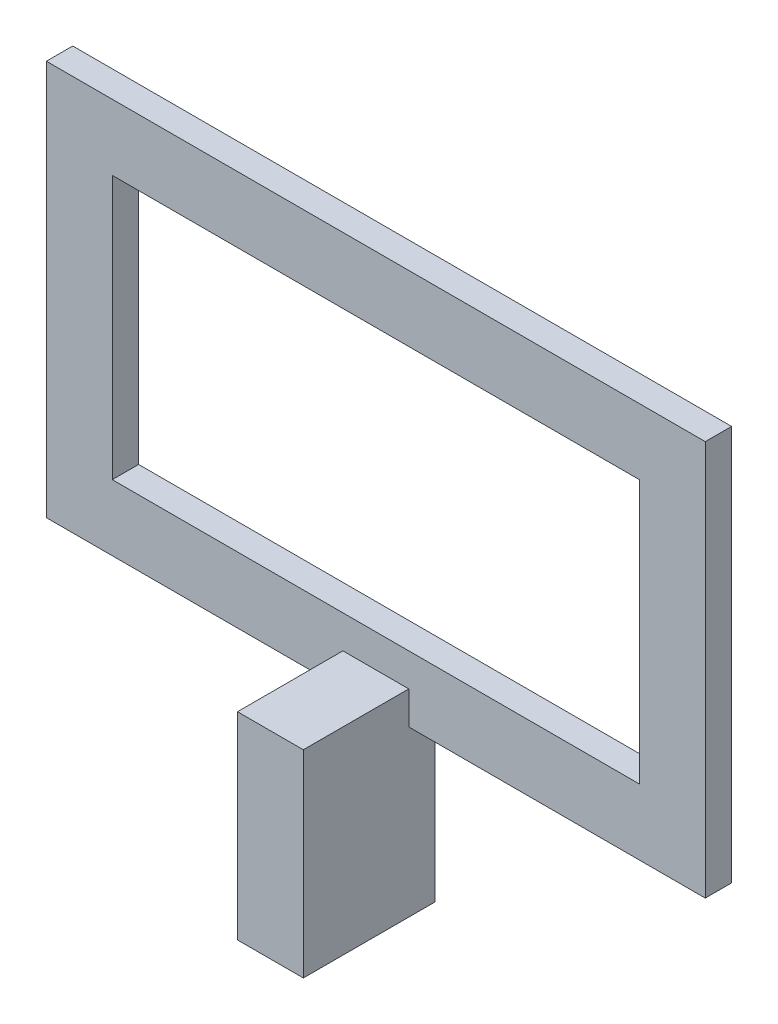
ISO-10303-21;
HEADER;
FILE_DESCRIPTION(('STEP AP214'),'2;1');
FILE_NAME('part.step','',(''),(''),'','','');
FILE_SCHEMA(('AUTOMOTIVE_DESIGN { 1 0 10303 214 1 1 1 1 }'));
ENDSEC;
DATA;
#1=APPLICATION_CONTEXT('core data for automotive mechanical design processes');
#2=APPLICATION_PROTOCOL_DEFINITION('international standard','automotive_design',2000,#1);
#3=PRODUCT_CONTEXT('',#1,'mechanical');
#4=PRODUCT('Part','Part','',(#3));
#5=PRODUCT_RELATED_PRODUCT_CATEGORY('part','',(#4));
#6=PRODUCT_DEFINITION_FORMATION('','',#4);
#7=PRODUCT_DEFINITION_CONTEXT('part definition',#1,'design');
#8=PRODUCT_DEFINITION('design','',#6,#7);
#9=PRODUCT_DEFINITION_SHAPE('','',#8);
#10=(LENGTH_UNIT() NAMED_UNIT(*) SI_UNIT(.MILLI.,.METRE.));
#11=(NAMED_UNIT(*) PLANE_ANGLE_UNIT() SI_UNIT($,.RADIAN.));
#12=(NAMED_UNIT(*) SI_UNIT($,.STERADIAN.) SOLID_ANGLE_UNIT());
#13=UNCERTAINTY_MEASURE_WITH_UNIT(LENGTH_MEASURE(1.E-05),#10,'distance_accuracy_value','');
#14=(GEOMETRIC_REPRESENTATION_CONTEXT(3) GLOBAL_UNCERTAINTY_ASSIGNED_CONTEXT((#13)) GLOBAL_UNIT_ASSIGNED_CONTEXT((#10,
#11,#12)) REPRESENTATION_CONTEXT('',''));
#15=CARTESIAN_POINT('',(0.,0.,0.));
#16=DIRECTION('',(0.,0.,1.));
#17=DIRECTION('',(1.,0.,0.));
#18=AXIS2_PLACEMENT_3D('',#15,#16,#17);
#19=CARTESIAN_POINT('',(0.,0.,20.));
#20=DIRECTION('',(0.,0.,-1.));
#21=DIRECTION('',(-1.,0.,0.));
#22=AXIS2_PLACEMENT_3D('',#19,#20,#21);
#23=PLANE('',#22);
#24=DIRECTION('',(0.,1.,0.));
#25=VECTOR('',#24,1.);
#26=CARTESIAN_POINT('',(200.,-100.,20.));
#27=LINE('',#26,#25);
#28=CARTESIAN_POINT('',(200.,-100.,20.));
#29=VERTEX_POINT('',#28);
#30=CARTESIAN_POINT('',(200.,100.,20.));
#31=VERTEX_POINT('',#30);
#32=EDGE_CURVE('E173',#29,#31,#27,.T.);
#33=ORIENTED_EDGE('',*,*,#32,.F.);
#34=DIRECTION('',(1.,0.,0.));
#35=VECTOR('',#34,1.);
#36=CARTESIAN_POINT('',(-200.,-100.,20.));
#37=LINE('',#36,#35);
#38=CARTESIAN_POINT('',(-200.,-100.,20.));
#39=VERTEX_POINT('',#38);
#40=EDGE_CURVE('E181',#39,#29,#37,.T.);
#41=ORIENTED_EDGE('',*,*,#40,.F.);
#42=DIRECTION('',(0.,-1.,0.));
#43=VECTOR('',#42,1.);
#44=CARTESIAN_POINT('',(-200.,-100.,20.));
#45=LINE('',#44,#43);
#46=CARTESIAN_POINT('',(-200.,100.,20.));
#47=VERTEX_POINT('',#46);
#48=EDGE_CURVE('E178',#47,#39,#45,.T.);
#49=ORIENTED_EDGE('',*,*,#48,.F.);
#50=DIRECTION('',(-1.,0.,0.));
#51=VECTOR('',#50,1.);
#52=CARTESIAN_POINT('',(-200.,100.,20.));
#53=LINE('',#52,#51);
#54=EDGE_CURVE('E175',#31,#47,#53,.T.);
#55=ORIENTED_EDGE('',*,*,#54,.F.);
#56=EDGE_LOOP('',(#33,#41,#49,#55));
#57=FACE_BOUND('',#56,.T.);
#58=DIRECTION('',(0.,1.,0.));
#59=VECTOR('',#58,1.);
#60=CARTESIAN_POINT('',(25.,0.,20.));
#61=LINE('',#60,#59);
#62=CARTESIAN_POINT('',(25.,-150.,20.));
#63=VERTEX_POINT('',#62);
#64=CARTESIAN_POINT('',(25.,-125.,20.));
#65=VERTEX_POINT('',#64);
#66=EDGE_CURVE('E163',#63,#65,#61,.T.);
#67=ORIENTED_EDGE('',*,*,#66,.F.);
#68=DIRECTION('',(1.,0.,0.));
#69=VECTOR('',#68,1.);
#70=CARTESIAN_POINT('',(-250.,-150.,20.));
#71=LINE('',#70,#69);
#72=CARTESIAN_POINT('',(250.,-150.,20.));
#73=VERTEX_POINT('',#72);
#74=EDGE_CURVE('E212',#63,#73,#71,.T.);
#75=ORIENTED_EDGE('',*,*,#74,.T.);
#76=DIRECTION('',(0.,1.,0.));
#77=VECTOR('',#76,1.);
#78=CARTESIAN_POINT('',(250.,-150.,20.));
#79=LINE('',#78,#77);
#80=CARTESIAN_POINT('',(250.,150.,20.));
#81=VERTEX_POINT('',#80);
#82=EDGE_CURVE('E204',#73,#81,#79,.T.);
#83=ORIENTED_EDGE('',*,*,#82,.T.);
#84=DIRECTION('',(-1.,0.,0.));
#85=VECTOR('',#84,1.);
#86=CARTESIAN_POINT('',(-250.,150.,20.));
#87=LINE('',#86,#85);
#88=CARTESIAN_POINT('',(-250.,150.,20.));
#89=VERTEX_POINT('',#88);
#90=EDGE_CURVE('E207',#81,#89,#87,.T.);
#91=ORIENTED_EDGE('',*,*,#90,.T.);
#92=DIRECTION('',(0.,-1.,0.));
#93=VECTOR('',#92,1.);
#94=CARTESIAN_POINT('',(-250.,-150.,20.));
#95=LINE('',#94,#93);
#96=CARTESIAN_POINT('',(-250.,-150.,20.));
#97=VERTEX_POINT('',#96);
#98=EDGE_CURVE('E210',#89,#97,#95,.T.);
#99=ORIENTED_EDGE('',*,*,#98,.T.);
#100=CARTESIAN_POINT('',(-25.,-150.,20.));
#101=VERTEX_POINT('',#100);
#102=EDGE_CURVE('E213',#97,#101,#71,.T.);
#103=ORIENTED_EDGE('',*,*,#102,.T.);
#104=DIRECTION('',(0.,-1.,0.));
#105=VECTOR('',#104,1.);
#106=CARTESIAN_POINT('',(-25.,0.,20.));
#107=LINE('',#106,#105);
#108=CARTESIAN_POINT('',(-25.,-125.,20.));
#109=VERTEX_POINT('',#108);
#110=EDGE_CURVE('E61',#109,#101,#107,.T.);
#111=ORIENTED_EDGE('',*,*,#110,.F.);
#112=DIRECTION('',(-1.,0.,0.));
#113=VECTOR('',#112,1.);
#114=CARTESIAN_POINT('',(0.,-125.,20.));
#115=LINE('',#114,#113);
#116=EDGE_CURVE('E56',#65,#109,#115,.T.);
#117=ORIENTED_EDGE('',*,*,#116,.F.);
#118=EDGE_LOOP('',(#67,#75,#83,#91,#99,#103,#111,#117));
#119=FACE_BOUND('',#118,.T.);
#120=ADVANCED_FACE('F41',(#57,#119),#23,.F.);
#121=CARTESIAN_POINT('',(-250.,-150.,20.));
#122=DIRECTION('',(0.,1.,0.));
#123=DIRECTION('',(0.,0.,1.));
#124=AXIS2_PLACEMENT_3D('',#121,#122,#123);
#125=PLANE('',#124);
#126=DIRECTION('',(0.,0.,1.));
#127=VECTOR('',#126,1.);
#128=CARTESIAN_POINT('',(25.,-150.,20.));
#129=LINE('',#128,#127);
#130=CARTESIAN_POINT('',(25.,-150.,0.));
#131=VERTEX_POINT('',#130);
#132=EDGE_CURVE('E11',#131,#63,#129,.T.);
#133=ORIENTED_EDGE('',*,*,#132,.F.);
#134=DIRECTION('',(1.,0.,0.));
#135=VECTOR('',#134,1.);
#136=CARTESIAN_POINT('',(-250.,-150.,0.));
#137=LINE('',#136,#135);
#138=CARTESIAN_POINT('',(250.,-150.,0.));
#139=VERTEX_POINT('',#138);
#140=EDGE_CURVE('E222',#131,#139,#137,.T.);
#141=ORIENTED_EDGE('',*,*,#140,.T.);
#142=DIRECTION('',(0.,0.,-1.));
#143=VECTOR('',#142,1.);
#144=CARTESIAN_POINT('',(250.,-150.,20.));
#145=LINE('',#144,#143);
#146=EDGE_CURVE('E215',#73,#139,#145,.T.);
#147=ORIENTED_EDGE('',*,*,#146,.F.);
#148=ORIENTED_EDGE('',*,*,#74,.F.);
#149=EDGE_LOOP('',(#133,#141,#147,#148));
#150=FACE_BOUND('',#149,.T.);
#151=ADVANCED_FACE('F266',(#150),#125,.F.);
#152=DIRECTION('',(0.,0.,-1.));
#153=VECTOR('',#152,1.);
#154=CARTESIAN_POINT('',(-25.,-150.,20.));
#155=LINE('',#154,#153);
#156=CARTESIAN_POINT('',(-25.,-150.,0.));
#157=VERTEX_POINT('',#156);
#158=EDGE_CURVE('E49',#101,#157,#155,.T.);
#159=ORIENTED_EDGE('',*,*,#158,.F.);
#160=ORIENTED_EDGE('',*,*,#102,.F.);
#161=DIRECTION('',(0.,0.,-1.));
#162=VECTOR('',#161,1.);
#163=CARTESIAN_POINT('',(-250.,-150.,20.));
#164=LINE('',#163,#162);
#165=CARTESIAN_POINT('',(-250.,-150.,0.));
#166=VERTEX_POINT('',#165);
#167=EDGE_CURVE('E226',#97,#166,#164,.T.);
#168=ORIENTED_EDGE('',*,*,#167,.T.);
#169=EDGE_CURVE('E208',#166,#157,#137,.T.);
#170=ORIENTED_EDGE('',*,*,#169,.T.);
#171=EDGE_LOOP('',(#159,#160,#168,#170));
#172=FACE_BOUND('',#171,.T.);
#173=ADVANCED_FACE('F277',(#172),#125,.F.);
#174=CARTESIAN_POINT('',(0.,0.,0.));
#175=DIRECTION('',(0.,0.,-1.));
#176=DIRECTION('',(-1.,0.,0.));
#177=AXIS2_PLACEMENT_3D('',#174,#175,#176);
#178=PLANE('',#177);
#179=ORIENTED_EDGE('',*,*,#140,.F.);
#180=DIRECTION('',(0.,1.,0.));
#181=VECTOR('',#180,1.);
#182=CARTESIAN_POINT('',(25.,-275.,0.));
#183=LINE('',#182,#181);
#184=CARTESIAN_POINT('',(25.,-275.,0.));
#185=VERTEX_POINT('',#184);
#186=EDGE_CURVE('E250',#185,#131,#183,.T.);
#187=ORIENTED_EDGE('',*,*,#186,.F.);
#188=DIRECTION('',(1.,0.,0.));
#189=VECTOR('',#188,1.);
#190=CARTESIAN_POINT('',(-25.,-275.,0.));
#191=LINE('',#190,#189);
#192=CARTESIAN_POINT('',(-25.,-275.,0.));
#193=VERTEX_POINT('',#192);
#194=EDGE_CURVE('E160',#193,#185,#191,.T.);
#195=ORIENTED_EDGE('',*,*,#194,.F.);
#196=DIRECTION('',(0.,-1.,0.));
#197=VECTOR('',#196,1.);
#198=CARTESIAN_POINT('',(-25.,-275.,0.));
#199=LINE('',#198,#197);
#200=EDGE_CURVE('E239',#157,#193,#199,.T.);
#201=ORIENTED_EDGE('',*,*,#200,.F.);
#202=ORIENTED_EDGE('',*,*,#169,.F.);
#203=DIRECTION('',(0.,-1.,0.));
#204=VECTOR('',#203,1.);
#205=CARTESIAN_POINT('',(-250.,-150.,0.));
#206=LINE('',#205,#204);
#207=CARTESIAN_POINT('',(-250.,150.,0.));
#208=VERTEX_POINT('',#207);
#209=EDGE_CURVE('E220',#208,#166,#206,.T.);
#210=ORIENTED_EDGE('',*,*,#209,.F.);
#211=DIRECTION('',(-1.,0.,0.));
#212=VECTOR('',#211,1.);
#213=CARTESIAN_POINT('',(-250.,150.,0.));
#214=LINE('',#213,#212);
#215=CARTESIAN_POINT('',(250.,150.,0.));
#216=VERTEX_POINT('',#215);
#217=EDGE_CURVE('E218',#216,#208,#214,.T.);
#218=ORIENTED_EDGE('',*,*,#217,.F.);
#219=DIRECTION('',(0.,1.,0.));
#220=VECTOR('',#219,1.);
#221=CARTESIAN_POINT('',(250.,-150.,0.));
#222=LINE('',#221,#220);
#223=EDGE_CURVE('E203',#139,#216,#222,.T.);
#224=ORIENTED_EDGE('',*,*,#223,.F.);
#225=EDGE_LOOP('',(#179,#187,#195,#201,#202,#210,#218,#224));
#226=FACE_BOUND('',#225,.T.);
#227=DIRECTION('',(1.,0.,0.));
#228=VECTOR('',#227,1.);
#229=CARTESIAN_POINT('',(-200.,-100.,0.));
#230=LINE('',#229,#228);
#231=CARTESIAN_POINT('',(-200.,-100.,0.));
#232=VERTEX_POINT('',#231);
#233=CARTESIAN_POINT('',(200.,-100.,0.));
#234=VERTEX_POINT('',#233);
#235=EDGE_CURVE('E176',#232,#234,#230,.T.);
#236=ORIENTED_EDGE('',*,*,#235,.T.);
#237=DIRECTION('',(0.,1.,0.));
#238=VECTOR('',#237,1.);
#239=CARTESIAN_POINT('',(200.,-100.,0.));
#240=LINE('',#239,#238);
#241=CARTESIAN_POINT('',(200.,100.,0.));
#242=VERTEX_POINT('',#241);
#243=EDGE_CURVE('E172',#234,#242,#240,.T.);
#244=ORIENTED_EDGE('',*,*,#243,.T.);
#245=DIRECTION('',(-1.,0.,0.));
#246=VECTOR('',#245,1.);
#247=CARTESIAN_POINT('',(-200.,100.,0.));
#248=LINE('',#247,#246);
#249=CARTESIAN_POINT('',(-200.,100.,0.));
#250=VERTEX_POINT('',#249);
#251=EDGE_CURVE('E186',#242,#250,#248,.T.);
#252=ORIENTED_EDGE('',*,*,#251,.T.);
#253=DIRECTION('',(0.,-1.,0.));
#254=VECTOR('',#253,1.);
#255=CARTESIAN_POINT('',(-200.,-100.,0.));
#256=LINE('',#255,#254);
#257=EDGE_CURVE('E189',#250,#232,#256,.T.);
#258=ORIENTED_EDGE('',*,*,#257,.T.);
#259=EDGE_LOOP('',(#236,#244,#252,#258));
#260=FACE_BOUND('',#259,.T.);
#261=ADVANCED_FACE('F246',(#226,#260),#178,.T.);
#262=CARTESIAN_POINT('',(250.,-150.,20.));
#263=DIRECTION('',(-1.,0.,0.));
#264=DIRECTION('',(0.,0.,1.));
#265=AXIS2_PLACEMENT_3D('',#262,#263,#264);
#266=PLANE('',#265);
#267=ORIENTED_EDGE('',*,*,#223,.T.);
#268=DIRECTION('',(0.,0.,-1.));
#269=VECTOR('',#268,1.);
#270=CARTESIAN_POINT('',(250.,150.,20.));
#271=LINE('',#270,#269);
#272=EDGE_CURVE('E232',#81,#216,#271,.T.);
#273=ORIENTED_EDGE('',*,*,#272,.F.);
#274=ORIENTED_EDGE('',*,*,#82,.F.);
#275=ORIENTED_EDGE('',*,*,#146,.T.);
#276=EDGE_LOOP('',(#267,#273,#274,#275));
#277=FACE_BOUND('',#276,.T.);
#278=ADVANCED_FACE('F43',(#277),#266,.F.);
#279=CARTESIAN_POINT('',(-250.,150.,20.));
#280=DIRECTION('',(0.,-1.,0.));
#281=DIRECTION('',(0.,0.,-1.));
#282=AXIS2_PLACEMENT_3D('',#279,#280,#281);
#283=PLANE('',#282);
#284=ORIENTED_EDGE('',*,*,#217,.T.);
#285=DIRECTION('',(0.,0.,-1.));
#286=VECTOR('',#285,1.);
#287=CARTESIAN_POINT('',(-250.,150.,20.));
#288=LINE('',#287,#286);
#289=EDGE_CURVE('E229',#89,#208,#288,.T.);
#290=ORIENTED_EDGE('',*,*,#289,.F.);
#291=ORIENTED_EDGE('',*,*,#90,.F.);
#292=ORIENTED_EDGE('',*,*,#272,.T.);
#293=EDGE_LOOP('',(#284,#290,#291,#292));
#294=FACE_BOUND('',#293,.T.);
#295=ADVANCED_FACE('F272',(#294),#283,.F.);
#296=CARTESIAN_POINT('',(-250.,-150.,20.));
#297=DIRECTION('',(1.,0.,0.));
#298=DIRECTION('',(0.,0.,-1.));
#299=AXIS2_PLACEMENT_3D('',#296,#297,#298);
#300=PLANE('',#299);
#301=ORIENTED_EDGE('',*,*,#209,.T.);
#302=ORIENTED_EDGE('',*,*,#167,.F.);
#303=ORIENTED_EDGE('',*,*,#98,.F.);
#304=ORIENTED_EDGE('',*,*,#289,.T.);
#305=EDGE_LOOP('',(#301,#302,#303,#304));
#306=FACE_BOUND('',#305,.T.);
#307=ADVANCED_FACE('F276',(#306),#300,.F.);
#308=CARTESIAN_POINT('',(200.,-100.,20.));
#309=DIRECTION('',(-1.,0.,0.));
#310=DIRECTION('',(0.,0.,1.));
#311=AXIS2_PLACEMENT_3D('',#308,#309,#310);
#312=PLANE('',#311);
#313=ORIENTED_EDGE('',*,*,#243,.F.);
#314=DIRECTION('',(0.,0.,-1.));
#315=VECTOR('',#314,1.);
#316=CARTESIAN_POINT('',(200.,-100.,20.));
#317=LINE('',#316,#315);
#318=EDGE_CURVE('E183',#29,#234,#317,.T.);
#319=ORIENTED_EDGE('',*,*,#318,.F.);
#320=ORIENTED_EDGE('',*,*,#32,.T.);
#321=DIRECTION('',(0.,0.,-1.));
#322=VECTOR('',#321,1.);
#323=CARTESIAN_POINT('',(200.,100.,20.));
#324=LINE('',#323,#322);
#325=EDGE_CURVE('E200',#31,#242,#324,.T.);
#326=ORIENTED_EDGE('',*,*,#325,.T.);
#327=EDGE_LOOP('',(#313,#319,#320,#326));
#328=FACE_BOUND('',#327,.T.);
#329=ADVANCED_FACE('F294',(#328),#312,.T.);
#330=CARTESIAN_POINT('',(-200.,100.,20.));
#331=DIRECTION('',(0.,-1.,0.));
#332=DIRECTION('',(0.,0.,-1.));
#333=AXIS2_PLACEMENT_3D('',#330,#331,#332);
#334=PLANE('',#333);
#335=ORIENTED_EDGE('',*,*,#251,.F.);
#336=ORIENTED_EDGE('',*,*,#325,.F.);
#337=ORIENTED_EDGE('',*,*,#54,.T.);
#338=DIRECTION('',(0.,0.,-1.));
#339=VECTOR('',#338,1.);
#340=CARTESIAN_POINT('',(-200.,100.,20.));
#341=LINE('',#340,#339);
#342=EDGE_CURVE('E198',#47,#250,#341,.T.);
#343=ORIENTED_EDGE('',*,*,#342,.T.);
#344=EDGE_LOOP('',(#335,#336,#337,#343));
#345=FACE_BOUND('',#344,.T.);
#346=ADVANCED_FACE('F297',(#345),#334,.T.);
#347=CARTESIAN_POINT('',(-200.,-100.,20.));
#348=DIRECTION('',(1.,0.,0.));
#349=DIRECTION('',(0.,0.,-1.));
#350=AXIS2_PLACEMENT_3D('',#347,#348,#349);
#351=PLANE('',#350);
#352=ORIENTED_EDGE('',*,*,#257,.F.);
#353=ORIENTED_EDGE('',*,*,#342,.F.);
#354=ORIENTED_EDGE('',*,*,#48,.T.);
#355=DIRECTION('',(0.,0.,-1.));
#356=VECTOR('',#355,1.);
#357=CARTESIAN_POINT('',(-200.,-100.,20.));
#358=LINE('',#357,#356);
#359=EDGE_CURVE('E196',#39,#232,#358,.T.);
#360=ORIENTED_EDGE('',*,*,#359,.T.);
#361=EDGE_LOOP('',(#352,#353,#354,#360));
#362=FACE_BOUND('',#361,.T.);
#363=ADVANCED_FACE('F301',(#362),#351,.T.);
#364=CARTESIAN_POINT('',(-200.,-100.,20.));
#365=DIRECTION('',(0.,1.,0.));
#366=DIRECTION('',(0.,0.,1.));
#367=AXIS2_PLACEMENT_3D('',#364,#365,#366);
#368=PLANE('',#367);
#369=ORIENTED_EDGE('',*,*,#235,.F.);
#370=ORIENTED_EDGE('',*,*,#359,.F.);
#371=ORIENTED_EDGE('',*,*,#40,.T.);
#372=ORIENTED_EDGE('',*,*,#318,.T.);
#373=EDGE_LOOP('',(#369,#370,#371,#372));
#374=FACE_BOUND('',#373,.T.);
#375=ADVANCED_FACE('F305',(#374),#368,.T.);
#376=CARTESIAN_POINT('',(-25.,-125.,100.));
#377=DIRECTION('',(0.,-1.,0.));
#378=DIRECTION('',(0.,0.,-1.));
#379=AXIS2_PLACEMENT_3D('',#376,#377,#378);
#380=PLANE('',#379);
#381=DIRECTION('',(0.,0.,-1.));
#382=VECTOR('',#381,1.);
#383=CARTESIAN_POINT('',(25.,-125.,100.));
#384=LINE('',#383,#382);
#385=CARTESIAN_POINT('',(25.,-125.,100.));
#386=VERTEX_POINT('',#385);
#387=EDGE_CURVE('E145',#386,#65,#384,.T.);
#388=ORIENTED_EDGE('',*,*,#387,.T.);
#389=ORIENTED_EDGE('',*,*,#116,.T.);
#390=DIRECTION('',(0.,0.,-1.));
#391=VECTOR('',#390,1.);
#392=CARTESIAN_POINT('',(-25.,-125.,100.));
#393=LINE('',#392,#391);
#394=CARTESIAN_POINT('',(-25.,-125.,100.));
#395=VERTEX_POINT('',#394);
#396=EDGE_CURVE('E147',#395,#109,#393,.T.);
#397=ORIENTED_EDGE('',*,*,#396,.F.);
#398=DIRECTION('',(-1.,0.,0.));
#399=VECTOR('',#398,1.);
#400=CARTESIAN_POINT('',(-25.,-125.,100.));
#401=LINE('',#400,#399);
#402=EDGE_CURVE('E141',#386,#395,#401,.T.);
#403=ORIENTED_EDGE('',*,*,#402,.F.);
#404=EDGE_LOOP('',(#388,#389,#397,#403));
#405=FACE_BOUND('',#404,.T.);
#406=ADVANCED_FACE('F143',(#405),#380,.F.);
#407=CARTESIAN_POINT('',(25.,-275.,100.));
#408=DIRECTION('',(-1.,0.,0.));
#409=DIRECTION('',(0.,0.,1.));
#410=AXIS2_PLACEMENT_3D('',#407,#408,#409);
#411=PLANE('',#410);
#412=ORIENTED_EDGE('',*,*,#132,.T.);
#413=ORIENTED_EDGE('',*,*,#66,.T.);
#414=ORIENTED_EDGE('',*,*,#387,.F.);
#415=DIRECTION('',(0.,1.,0.));
#416=VECTOR('',#415,1.);
#417=CARTESIAN_POINT('',(25.,-275.,100.));
#418=LINE('',#417,#416);
#419=CARTESIAN_POINT('',(25.,-275.,100.));
#420=VERTEX_POINT('',#419);
#421=EDGE_CURVE('E151',#420,#386,#418,.T.);
#422=ORIENTED_EDGE('',*,*,#421,.F.);
#423=DIRECTION('',(0.,0.,-1.));
#424=VECTOR('',#423,1.);
#425=CARTESIAN_POINT('',(25.,-275.,100.));
#426=LINE('',#425,#424);
#427=EDGE_CURVE('E257',#420,#185,#426,.T.);
#428=ORIENTED_EDGE('',*,*,#427,.T.);
#429=ORIENTED_EDGE('',*,*,#186,.T.);
#430=EDGE_LOOP('',(#412,#413,#414,#422,#428,#429));
#431=FACE_BOUND('',#430,.T.);
#432=ADVANCED_FACE('F162',(#431),#411,.F.);
#433=CARTESIAN_POINT('',(-25.,-275.,100.));
#434=DIRECTION('',(1.,0.,0.));
#435=DIRECTION('',(0.,0.,-1.));
#436=AXIS2_PLACEMENT_3D('',#433,#434,#435);
#437=PLANE('',#436);
#438=ORIENTED_EDGE('',*,*,#396,.T.);
#439=ORIENTED_EDGE('',*,*,#110,.T.);
#440=ORIENTED_EDGE('',*,*,#158,.T.);
#441=ORIENTED_EDGE('',*,*,#200,.T.);
#442=DIRECTION('',(0.,0.,-1.));
#443=VECTOR('',#442,1.);
#444=CARTESIAN_POINT('',(-25.,-275.,100.));
#445=LINE('',#444,#443);
#446=CARTESIAN_POINT('',(-25.,-275.,100.));
#447=VERTEX_POINT('',#446);
#448=EDGE_CURVE('E166',#447,#193,#445,.T.);
#449=ORIENTED_EDGE('',*,*,#448,.F.);
#450=DIRECTION('',(0.,-1.,0.));
#451=VECTOR('',#450,1.);
#452=CARTESIAN_POINT('',(-25.,-275.,100.));
#453=LINE('',#452,#451);
#454=EDGE_CURVE('E150',#395,#447,#453,.T.);
#455=ORIENTED_EDGE('',*,*,#454,.F.);
#456=EDGE_LOOP('',(#438,#439,#440,#441,#449,#455));
#457=FACE_BOUND('',#456,.T.);
#458=ADVANCED_FACE('F237',(#457),#437,.F.);
#459=CARTESIAN_POINT('',(-25.,-275.,100.));
#460=DIRECTION('',(0.,1.,0.));
#461=DIRECTION('',(0.,0.,1.));
#462=AXIS2_PLACEMENT_3D('',#459,#460,#461);
#463=PLANE('',#462);
#464=ORIENTED_EDGE('',*,*,#194,.T.);
#465=ORIENTED_EDGE('',*,*,#427,.F.);
#466=DIRECTION('',(1.,0.,0.));
#467=VECTOR('',#466,1.);
#468=CARTESIAN_POINT('',(-25.,-275.,100.));
#469=LINE('',#468,#467);
#470=EDGE_CURVE('E156',#447,#420,#469,.T.);
#471=ORIENTED_EDGE('',*,*,#470,.F.);
#472=ORIENTED_EDGE('',*,*,#448,.T.);
#473=EDGE_LOOP('',(#464,#465,#471,#472));
#474=FACE_BOUND('',#473,.T.);
#475=ADVANCED_FACE('F259',(#474),#463,.F.);
#476=CARTESIAN_POINT('',(0.,0.,100.));
#477=DIRECTION('',(0.,0.,-1.));
#478=DIRECTION('',(-1.,0.,0.));
#479=AXIS2_PLACEMENT_3D('',#476,#477,#478);
#480=PLANE('',#479);
#481=ORIENTED_EDGE('',*,*,#421,.T.);
#482=ORIENTED_EDGE('',*,*,#402,.T.);
#483=ORIENTED_EDGE('',*,*,#454,.T.);
#484=ORIENTED_EDGE('',*,*,#470,.T.);
#485=EDGE_LOOP('',(#481,#482,#483,#484));
#486=FACE_BOUND('',#485,.T.);
#487=ADVANCED_FACE('F154',(#486),#480,.F.);
#488=CLOSED_SHELL('',(#120,#151,#173,#261,#278,#295,#307,#329,#346,#363,#375,#406,#432,#458,
#475,#487));
#489=MANIFOLD_SOLID_BREP('B2',#488);
#490=ADVANCED_BREP_SHAPE_REPRESENTATION('',(#18,#489),#14);
#491=SHAPE_DEFINITION_REPRESENTATION(#9,#490);
ENDSEC;
END-ISO-10303-21;
